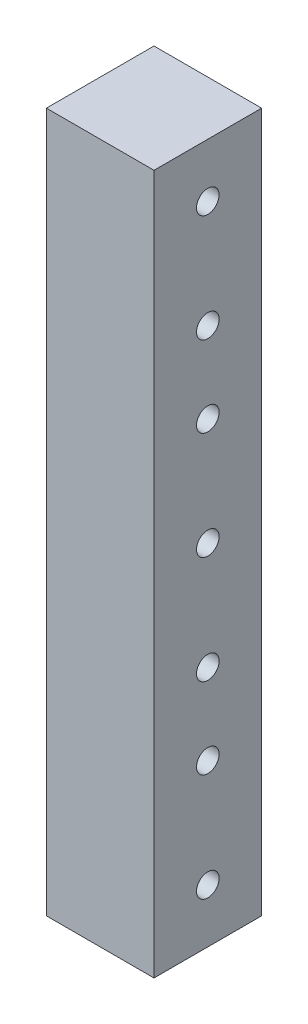
ISO-10303-21;
HEADER;
FILE_DESCRIPTION(('STEP AP214'),'2;1');
FILE_NAME('part.step','',(''),(''),'','','');
FILE_SCHEMA(('AUTOMOTIVE_DESIGN { 1 0 10303 214 1 1 1 1 }'));
ENDSEC;
DATA;
#1=APPLICATION_CONTEXT('core data for automotive mechanical design processes');
#2=APPLICATION_PROTOCOL_DEFINITION('international standard','automotive_design',2000,#1);
#3=PRODUCT_CONTEXT('',#1,'mechanical');
#4=PRODUCT('Part','Part','',(#3));
#5=PRODUCT_RELATED_PRODUCT_CATEGORY('part','',(#4));
#6=PRODUCT_DEFINITION_FORMATION('','',#4);
#7=PRODUCT_DEFINITION_CONTEXT('part definition',#1,'design');
#8=PRODUCT_DEFINITION('design','',#6,#7);
#9=PRODUCT_DEFINITION_SHAPE('','',#8);
#10=(LENGTH_UNIT() NAMED_UNIT(*) SI_UNIT(.MILLI.,.METRE.));
#11=(NAMED_UNIT(*) PLANE_ANGLE_UNIT() SI_UNIT($,.RADIAN.));
#12=(NAMED_UNIT(*) SI_UNIT($,.STERADIAN.) SOLID_ANGLE_UNIT());
#13=UNCERTAINTY_MEASURE_WITH_UNIT(LENGTH_MEASURE(1.E-05),#10,'distance_accuracy_value','');
#14=(GEOMETRIC_REPRESENTATION_CONTEXT(3) GLOBAL_UNCERTAINTY_ASSIGNED_CONTEXT((#13)) GLOBAL_UNIT_ASSIGNED_CONTEXT((#10,
#11,#12)) REPRESENTATION_CONTEXT('',''));
#15=CARTESIAN_POINT('',(0.,0.,0.));
#16=DIRECTION('',(0.,0.,1.));
#17=DIRECTION('',(1.,0.,0.));
#18=AXIS2_PLACEMENT_3D('',#15,#16,#17);
#19=CARTESIAN_POINT('',(9.99999999999999,130.,-10.));
#20=DIRECTION('',(-1.,0.,0.));
#21=DIRECTION('',(0.,0.,1.));
#22=AXIS2_PLACEMENT_3D('',#19,#20,#21);
#23=PLANE('',#22);
#24=CARTESIAN_POINT('',(9.99999999999999,10.,0.));
#25=DIRECTION('',(1.,0.,0.));
#26=DIRECTION('',(0.,0.,-1.));
#27=AXIS2_PLACEMENT_3D('',#24,#25,#26);
#28=CIRCLE('',#27,2.1);
#29=CARTESIAN_POINT('',(9.99999999999999,10.,-2.1));
#30=VERTEX_POINT('',#29);
#31=EDGE_CURVE('E161',#30,#30,#28,.T.);
#32=ORIENTED_EDGE('',*,*,#31,.F.);
#33=EDGE_LOOP('',(#32));
#34=FACE_BOUND('',#33,.T.);
#35=CARTESIAN_POINT('',(9.99999999999999,65.,0.));
#36=DIRECTION('',(1.,0.,0.));
#37=DIRECTION('',(0.,0.,-1.));
#38=AXIS2_PLACEMENT_3D('',#35,#36,#37);
#39=CIRCLE('',#38,2.1);
#40=CARTESIAN_POINT('',(9.99999999999999,65.,-2.09999999999993));
#41=VERTEX_POINT('',#40);
#42=EDGE_CURVE('E153',#41,#41,#39,.T.);
#43=ORIENTED_EDGE('',*,*,#42,.F.);
#44=EDGE_LOOP('',(#43));
#45=FACE_BOUND('',#44,.T.);
#46=CARTESIAN_POINT('',(9.99999999999999,85.,1.35325475594872E-13));
#47=DIRECTION('',(1.,0.,0.));
#48=DIRECTION('',(0.,0.,-1.));
#49=AXIS2_PLACEMENT_3D('',#46,#47,#48);
#50=CIRCLE('',#49,2.1);
#51=CARTESIAN_POINT('',(9.99999999999999,85.,-2.09999999999987));
#52=VERTEX_POINT('',#51);
#53=EDGE_CURVE('E145',#52,#52,#50,.T.);
#54=ORIENTED_EDGE('',*,*,#53,.F.);
#55=EDGE_LOOP('',(#54));
#56=FACE_BOUND('',#55,.T.);
#57=CARTESIAN_POINT('',(9.99999999999999,100.,0.));
#58=DIRECTION('',(1.,0.,0.));
#59=DIRECTION('',(0.,0.,1.));
#60=AXIS2_PLACEMENT_3D('',#57,#58,#59);
#61=CIRCLE('',#60,2.1);
#62=CARTESIAN_POINT('',(9.99999999999999,100.,2.10000000000007));
#63=VERTEX_POINT('',#62);
#64=EDGE_CURVE('E136',#63,#63,#61,.T.);
#65=ORIENTED_EDGE('',*,*,#64,.F.);
#66=EDGE_LOOP('',(#65));
#67=FACE_BOUND('',#66,.T.);
#68=CARTESIAN_POINT('',(9.99999999999999,30.,0.));
#69=DIRECTION('',(1.,0.,0.));
#70=DIRECTION('',(0.,0.,-1.));
#71=AXIS2_PLACEMENT_3D('',#68,#69,#70);
#72=CIRCLE('',#71,2.1);
#73=CARTESIAN_POINT('',(9.99999999999999,30.,-2.09999999999993));
#74=VERTEX_POINT('',#73);
#75=EDGE_CURVE('E176',#74,#74,#72,.T.);
#76=ORIENTED_EDGE('',*,*,#75,.F.);
#77=EDGE_LOOP('',(#76));
#78=FACE_BOUND('',#77,.T.);
#79=CARTESIAN_POINT('',(9.99999999999999,120.,0.));
#80=DIRECTION('',(1.,0.,0.));
#81=DIRECTION('',(0.,0.,1.));
#82=AXIS2_PLACEMENT_3D('',#79,#80,#81);
#83=CIRCLE('',#82,2.1);
#84=CARTESIAN_POINT('',(9.99999999999999,120.,2.1));
#85=VERTEX_POINT('',#84);
#86=EDGE_CURVE('E168',#85,#85,#83,.T.);
#87=ORIENTED_EDGE('',*,*,#86,.F.);
#88=EDGE_LOOP('',(#87));
#89=FACE_BOUND('',#88,.T.);
#90=CARTESIAN_POINT('',(9.99999999999999,45.,0.));
#91=DIRECTION('',(1.,0.,0.));
#92=DIRECTION('',(0.,0.,-1.));
#93=AXIS2_PLACEMENT_3D('',#90,#91,#92);
#94=CIRCLE('',#93,2.1);
#95=CARTESIAN_POINT('',(9.99999999999999,45.,-2.1));
#96=VERTEX_POINT('',#95);
#97=EDGE_CURVE('E128',#96,#96,#94,.T.);
#98=ORIENTED_EDGE('',*,*,#97,.F.);
#99=EDGE_LOOP('',(#98));
#100=FACE_BOUND('',#99,.T.);
#101=DIRECTION('',(0.,0.,-1.));
#102=VECTOR('',#101,1.);
#103=CARTESIAN_POINT('',(9.99999999999999,0.,-10.));
#104=LINE('',#103,#102);
#105=CARTESIAN_POINT('',(10.,0.,10.));
#106=VERTEX_POINT('',#105);
#107=CARTESIAN_POINT('',(9.99999999999999,0.,-10.));
#108=VERTEX_POINT('',#107);
#109=EDGE_CURVE('E107',#106,#108,#104,.T.);
#110=ORIENTED_EDGE('',*,*,#109,.T.);
#111=DIRECTION('',(0.,-1.,0.));
#112=VECTOR('',#111,1.);
#113=CARTESIAN_POINT('',(9.99999999999999,130.,-10.));
#114=LINE('',#113,#112);
#115=CARTESIAN_POINT('',(9.99999999999999,130.,-10.));
#116=VERTEX_POINT('',#115);
#117=EDGE_CURVE('E11',#116,#108,#114,.T.);
#118=ORIENTED_EDGE('',*,*,#117,.F.);
#119=DIRECTION('',(0.,0.,-1.));
#120=VECTOR('',#119,1.);
#121=CARTESIAN_POINT('',(9.99999999999999,130.,-10.));
#122=LINE('',#121,#120);
#123=CARTESIAN_POINT('',(10.,130.,10.));
#124=VERTEX_POINT('',#123);
#125=EDGE_CURVE('E91',#124,#116,#122,.T.);
#126=ORIENTED_EDGE('',*,*,#125,.F.);
#127=DIRECTION('',(0.,-1.,0.));
#128=VECTOR('',#127,1.);
#129=CARTESIAN_POINT('',(10.,130.,10.));
#130=LINE('',#129,#128);
#131=EDGE_CURVE('E103',#124,#106,#130,.T.);
#132=ORIENTED_EDGE('',*,*,#131,.T.);
#133=EDGE_LOOP('',(#110,#118,#126,#132));
#134=FACE_BOUND('',#133,.T.);
#135=ADVANCED_FACE('F39',(#34,#45,#56,#67,#78,#89,#100,#134),#23,.F.);
#136=CARTESIAN_POINT('',(-10.,130.,-10.));
#137=DIRECTION('',(0.,0.,1.));
#138=DIRECTION('',(1.,0.,0.));
#139=AXIS2_PLACEMENT_3D('',#136,#137,#138);
#140=PLANE('',#139);
#141=DIRECTION('',(-1.,0.,0.));
#142=VECTOR('',#141,1.);
#143=CARTESIAN_POINT('',(-10.,0.,-10.));
#144=LINE('',#143,#142);
#145=CARTESIAN_POINT('',(-10.,0.,-10.));
#146=VERTEX_POINT('',#145);
#147=EDGE_CURVE('E96',#108,#146,#144,.T.);
#148=ORIENTED_EDGE('',*,*,#147,.T.);
#149=DIRECTION('',(0.,-1.,0.));
#150=VECTOR('',#149,1.);
#151=CARTESIAN_POINT('',(-10.,130.,-10.));
#152=LINE('',#151,#150);
#153=CARTESIAN_POINT('',(-10.,130.,-10.));
#154=VERTEX_POINT('',#153);
#155=EDGE_CURVE('E48',#154,#146,#152,.T.);
#156=ORIENTED_EDGE('',*,*,#155,.F.);
#157=DIRECTION('',(-1.,0.,0.));
#158=VECTOR('',#157,1.);
#159=CARTESIAN_POINT('',(-10.,130.,-10.));
#160=LINE('',#159,#158);
#161=EDGE_CURVE('E86',#116,#154,#160,.T.);
#162=ORIENTED_EDGE('',*,*,#161,.F.);
#163=ORIENTED_EDGE('',*,*,#117,.T.);
#164=EDGE_LOOP('',(#148,#156,#162,#163));
#165=FACE_BOUND('',#164,.T.);
#166=ADVANCED_FACE('F95',(#165),#140,.F.);
#167=CARTESIAN_POINT('',(-10.,130.,-10.));
#168=DIRECTION('',(1.,0.,0.));
#169=DIRECTION('',(0.,0.,-1.));
#170=AXIS2_PLACEMENT_3D('',#167,#168,#169);
#171=PLANE('',#170);
#172=CARTESIAN_POINT('',(-10.,10.,0.));
#173=DIRECTION('',(1.,0.,0.));
#174=DIRECTION('',(0.,0.,-1.));
#175=AXIS2_PLACEMENT_3D('',#172,#173,#174);
#176=CIRCLE('',#175,2.1);
#177=CARTESIAN_POINT('',(-10.,10.,-2.1));
#178=VERTEX_POINT('',#177);
#179=EDGE_CURVE('E132',#178,#178,#176,.T.);
#180=ORIENTED_EDGE('',*,*,#179,.T.);
#181=EDGE_LOOP('',(#180));
#182=FACE_BOUND('',#181,.T.);
#183=CARTESIAN_POINT('',(-10.,65.,0.));
#184=DIRECTION('',(1.,0.,0.));
#185=DIRECTION('',(0.,0.,-1.));
#186=AXIS2_PLACEMENT_3D('',#183,#184,#185);
#187=CIRCLE('',#186,2.1);
#188=CARTESIAN_POINT('',(-10.,65.,-2.09999999999993));
#189=VERTEX_POINT('',#188);
#190=EDGE_CURVE('E157',#189,#189,#187,.T.);
#191=ORIENTED_EDGE('',*,*,#190,.T.);
#192=EDGE_LOOP('',(#191));
#193=FACE_BOUND('',#192,.T.);
#194=CARTESIAN_POINT('',(-10.,85.,1.37060199070849E-13));
#195=DIRECTION('',(1.,0.,0.));
#196=DIRECTION('',(0.,0.,-1.));
#197=AXIS2_PLACEMENT_3D('',#194,#195,#196);
#198=CIRCLE('',#197,2.1);
#199=CARTESIAN_POINT('',(-10.,85.,-2.09999999999986));
#200=VERTEX_POINT('',#199);
#201=EDGE_CURVE('E149',#200,#200,#198,.T.);
#202=ORIENTED_EDGE('',*,*,#201,.T.);
#203=EDGE_LOOP('',(#202));
#204=FACE_BOUND('',#203,.T.);
#205=CARTESIAN_POINT('',(-10.,100.,0.));
#206=DIRECTION('',(1.,0.,0.));
#207=DIRECTION('',(0.,0.,1.));
#208=AXIS2_PLACEMENT_3D('',#205,#206,#207);
#209=CIRCLE('',#208,2.1);
#210=CARTESIAN_POINT('',(-10.,100.,2.10000000000007));
#211=VERTEX_POINT('',#210);
#212=EDGE_CURVE('E140',#211,#211,#209,.T.);
#213=ORIENTED_EDGE('',*,*,#212,.T.);
#214=EDGE_LOOP('',(#213));
#215=FACE_BOUND('',#214,.T.);
#216=CARTESIAN_POINT('',(-10.,30.,0.));
#217=DIRECTION('',(1.,0.,0.));
#218=DIRECTION('',(0.,0.,-1.));
#219=AXIS2_PLACEMENT_3D('',#216,#217,#218);
#220=CIRCLE('',#219,2.1);
#221=CARTESIAN_POINT('',(-10.,30.,-2.09999999999993));
#222=VERTEX_POINT('',#221);
#223=EDGE_CURVE('E141',#222,#222,#220,.T.);
#224=ORIENTED_EDGE('',*,*,#223,.T.);
#225=EDGE_LOOP('',(#224));
#226=FACE_BOUND('',#225,.T.);
#227=CARTESIAN_POINT('',(-10.,120.,0.));
#228=DIRECTION('',(1.,0.,0.));
#229=DIRECTION('',(0.,0.,1.));
#230=AXIS2_PLACEMENT_3D('',#227,#228,#229);
#231=CIRCLE('',#230,2.1);
#232=CARTESIAN_POINT('',(-10.,120.,2.1));
#233=VERTEX_POINT('',#232);
#234=EDGE_CURVE('E172',#233,#233,#231,.T.);
#235=ORIENTED_EDGE('',*,*,#234,.T.);
#236=EDGE_LOOP('',(#235));
#237=FACE_BOUND('',#236,.T.);
#238=CARTESIAN_POINT('',(-10.,45.,0.));
#239=DIRECTION('',(1.,0.,0.));
#240=DIRECTION('',(0.,0.,-1.));
#241=AXIS2_PLACEMENT_3D('',#238,#239,#240);
#242=CIRCLE('',#241,2.1);
#243=CARTESIAN_POINT('',(-10.,45.,-2.1));
#244=VERTEX_POINT('',#243);
#245=EDGE_CURVE('E111',#244,#244,#242,.T.);
#246=ORIENTED_EDGE('',*,*,#245,.T.);
#247=EDGE_LOOP('',(#246));
#248=FACE_BOUND('',#247,.T.);
#249=DIRECTION('',(0.,0.,1.));
#250=VECTOR('',#249,1.);
#251=CARTESIAN_POINT('',(-10.,0.,-10.));
#252=LINE('',#251,#250);
#253=CARTESIAN_POINT('',(-10.,0.,10.));
#254=VERTEX_POINT('',#253);
#255=EDGE_CURVE('E73',#146,#254,#252,.T.);
#256=ORIENTED_EDGE('',*,*,#255,.T.);
#257=DIRECTION('',(0.,-1.,0.));
#258=VECTOR('',#257,1.);
#259=CARTESIAN_POINT('',(-10.,130.,10.));
#260=LINE('',#259,#258);
#261=CARTESIAN_POINT('',(-10.,130.,10.));
#262=VERTEX_POINT('',#261);
#263=EDGE_CURVE('E98',#262,#254,#260,.T.);
#264=ORIENTED_EDGE('',*,*,#263,.F.);
#265=DIRECTION('',(0.,0.,1.));
#266=VECTOR('',#265,1.);
#267=CARTESIAN_POINT('',(-10.,130.,-10.));
#268=LINE('',#267,#266);
#269=EDGE_CURVE('E89',#154,#262,#268,.T.);
#270=ORIENTED_EDGE('',*,*,#269,.F.);
#271=ORIENTED_EDGE('',*,*,#155,.T.);
#272=EDGE_LOOP('',(#256,#264,#270,#271));
#273=FACE_BOUND('',#272,.T.);
#274=ADVANCED_FACE('F99',(#182,#193,#204,#215,#226,#237,#248,#273),#171,.F.);
#275=CARTESIAN_POINT('',(-10.,130.,10.));
#276=DIRECTION('',(0.,0.,-1.));
#277=DIRECTION('',(-1.,0.,0.));
#278=AXIS2_PLACEMENT_3D('',#275,#276,#277);
#279=PLANE('',#278);
#280=DIRECTION('',(1.,0.,0.));
#281=VECTOR('',#280,1.);
#282=CARTESIAN_POINT('',(-10.,0.,10.));
#283=LINE('',#282,#281);
#284=EDGE_CURVE('E79',#254,#106,#283,.T.);
#285=ORIENTED_EDGE('',*,*,#284,.T.);
#286=ORIENTED_EDGE('',*,*,#131,.F.);
#287=DIRECTION('',(1.,0.,0.));
#288=VECTOR('',#287,1.);
#289=CARTESIAN_POINT('',(-10.,130.,10.));
#290=LINE('',#289,#288);
#291=EDGE_CURVE('E56',#262,#124,#290,.T.);
#292=ORIENTED_EDGE('',*,*,#291,.F.);
#293=ORIENTED_EDGE('',*,*,#263,.T.);
#294=EDGE_LOOP('',(#285,#286,#292,#293));
#295=FACE_BOUND('',#294,.T.);
#296=ADVANCED_FACE('F121',(#295),#279,.F.);
#297=CARTESIAN_POINT('',(0.,130.,0.));
#298=DIRECTION('',(0.,1.,0.));
#299=DIRECTION('',(0.,0.,1.));
#300=AXIS2_PLACEMENT_3D('',#297,#298,#299);
#301=PLANE('',#300);
#302=ORIENTED_EDGE('',*,*,#125,.T.);
#303=ORIENTED_EDGE('',*,*,#161,.T.);
#304=ORIENTED_EDGE('',*,*,#269,.T.);
#305=ORIENTED_EDGE('',*,*,#291,.T.);
#306=EDGE_LOOP('',(#302,#303,#304,#305));
#307=FACE_BOUND('',#306,.T.);
#308=ADVANCED_FACE('F87',(#307),#301,.T.);
#309=CARTESIAN_POINT('',(0.,0.,0.));
#310=DIRECTION('',(0.,1.,0.));
#311=DIRECTION('',(0.,0.,1.));
#312=AXIS2_PLACEMENT_3D('',#309,#310,#311);
#313=PLANE('',#312);
#314=ORIENTED_EDGE('',*,*,#109,.F.);
#315=ORIENTED_EDGE('',*,*,#284,.F.);
#316=ORIENTED_EDGE('',*,*,#255,.F.);
#317=ORIENTED_EDGE('',*,*,#147,.F.);
#318=EDGE_LOOP('',(#314,#315,#316,#317));
#319=FACE_BOUND('',#318,.T.);
#320=ADVANCED_FACE('F124',(#319),#313,.F.);
#321=CARTESIAN_POINT('',(-10.,45.,0.));
#322=DIRECTION('',(1.,0.,0.));
#323=DIRECTION('',(0.,0.,-1.));
#324=AXIS2_PLACEMENT_3D('',#321,#322,#323);
#325=CYLINDRICAL_SURFACE('',#324,2.1);
#326=ORIENTED_EDGE('',*,*,#245,.F.);
#327=EDGE_LOOP('',(#326));
#328=FACE_BOUND('',#327,.T.);
#329=ORIENTED_EDGE('',*,*,#97,.T.);
#330=EDGE_LOOP('',(#329));
#331=FACE_BOUND('',#330,.T.);
#332=ADVANCED_FACE('F201',(#328,#331),#325,.F.);
#333=CARTESIAN_POINT('',(-10.,120.,0.));
#334=DIRECTION('',(1.,0.,0.));
#335=DIRECTION('',(0.,0.,-1.));
#336=AXIS2_PLACEMENT_3D('',#333,#334,#335);
#337=CYLINDRICAL_SURFACE('',#336,2.1);
#338=ORIENTED_EDGE('',*,*,#234,.F.);
#339=EDGE_LOOP('',(#338));
#340=FACE_BOUND('',#339,.T.);
#341=ORIENTED_EDGE('',*,*,#86,.T.);
#342=EDGE_LOOP('',(#341));
#343=FACE_BOUND('',#342,.T.);
#344=ADVANCED_FACE('F190',(#340,#343),#337,.F.);
#345=CARTESIAN_POINT('',(-10.,30.,0.));
#346=DIRECTION('',(1.,0.,0.));
#347=DIRECTION('',(0.,0.,-1.));
#348=AXIS2_PLACEMENT_3D('',#345,#346,#347);
#349=CYLINDRICAL_SURFACE('',#348,2.1);
#350=ORIENTED_EDGE('',*,*,#223,.F.);
#351=EDGE_LOOP('',(#350));
#352=FACE_BOUND('',#351,.T.);
#353=ORIENTED_EDGE('',*,*,#75,.T.);
#354=EDGE_LOOP('',(#353));
#355=FACE_BOUND('',#354,.T.);
#356=ADVANCED_FACE('F186',(#352,#355),#349,.F.);
#357=CARTESIAN_POINT('',(-10.,100.,0.));
#358=DIRECTION('',(1.,0.,0.));
#359=DIRECTION('',(0.,0.,-1.));
#360=AXIS2_PLACEMENT_3D('',#357,#358,#359);
#361=CYLINDRICAL_SURFACE('',#360,2.1);
#362=ORIENTED_EDGE('',*,*,#212,.F.);
#363=EDGE_LOOP('',(#362));
#364=FACE_BOUND('',#363,.T.);
#365=ORIENTED_EDGE('',*,*,#64,.T.);
#366=EDGE_LOOP('',(#365));
#367=FACE_BOUND('',#366,.T.);
#368=ADVANCED_FACE('F189',(#364,#367),#361,.F.);
#369=CARTESIAN_POINT('',(-10.,85.,1.37060199070849E-13));
#370=DIRECTION('',(1.,0.,0.));
#371=DIRECTION('',(0.,0.,-1.));
#372=AXIS2_PLACEMENT_3D('',#369,#370,#371);
#373=CYLINDRICAL_SURFACE('',#372,2.1);
#374=ORIENTED_EDGE('',*,*,#201,.F.);
#375=EDGE_LOOP('',(#374));
#376=FACE_BOUND('',#375,.T.);
#377=ORIENTED_EDGE('',*,*,#53,.T.);
#378=EDGE_LOOP('',(#377));
#379=FACE_BOUND('',#378,.T.);
#380=ADVANCED_FACE('F279',(#376,#379),#373,.F.);
#381=CARTESIAN_POINT('',(-10.,65.,0.));
#382=DIRECTION('',(1.,0.,0.));
#383=DIRECTION('',(0.,0.,-1.));
#384=AXIS2_PLACEMENT_3D('',#381,#382,#383);
#385=CYLINDRICAL_SURFACE('',#384,2.1);
#386=ORIENTED_EDGE('',*,*,#190,.F.);
#387=EDGE_LOOP('',(#386));
#388=FACE_BOUND('',#387,.T.);
#389=ORIENTED_EDGE('',*,*,#42,.T.);
#390=EDGE_LOOP('',(#389));
#391=FACE_BOUND('',#390,.T.);
#392=ADVANCED_FACE('F287',(#388,#391),#385,.F.);
#393=CARTESIAN_POINT('',(-10.,10.,0.));
#394=DIRECTION('',(1.,0.,0.));
#395=DIRECTION('',(0.,0.,-1.));
#396=AXIS2_PLACEMENT_3D('',#393,#394,#395);
#397=CYLINDRICAL_SURFACE('',#396,2.1);
#398=ORIENTED_EDGE('',*,*,#179,.F.);
#399=EDGE_LOOP('',(#398));
#400=FACE_BOUND('',#399,.T.);
#401=ORIENTED_EDGE('',*,*,#31,.T.);
#402=EDGE_LOOP('',(#401));
#403=FACE_BOUND('',#402,.T.);
#404=ADVANCED_FACE('F295',(#400,#403),#397,.F.);
#405=CLOSED_SHELL('',(#135,#166,#274,#296,#308,#320,#332,#344,#356,#368,#380,#392,#404));
#406=MANIFOLD_SOLID_BREP('B2',#405);
#407=ADVANCED_BREP_SHAPE_REPRESENTATION('',(#18,#406),#14);
#408=SHAPE_DEFINITION_REPRESENTATION(#9,#407);
ENDSEC;
END-ISO-10303-21;
